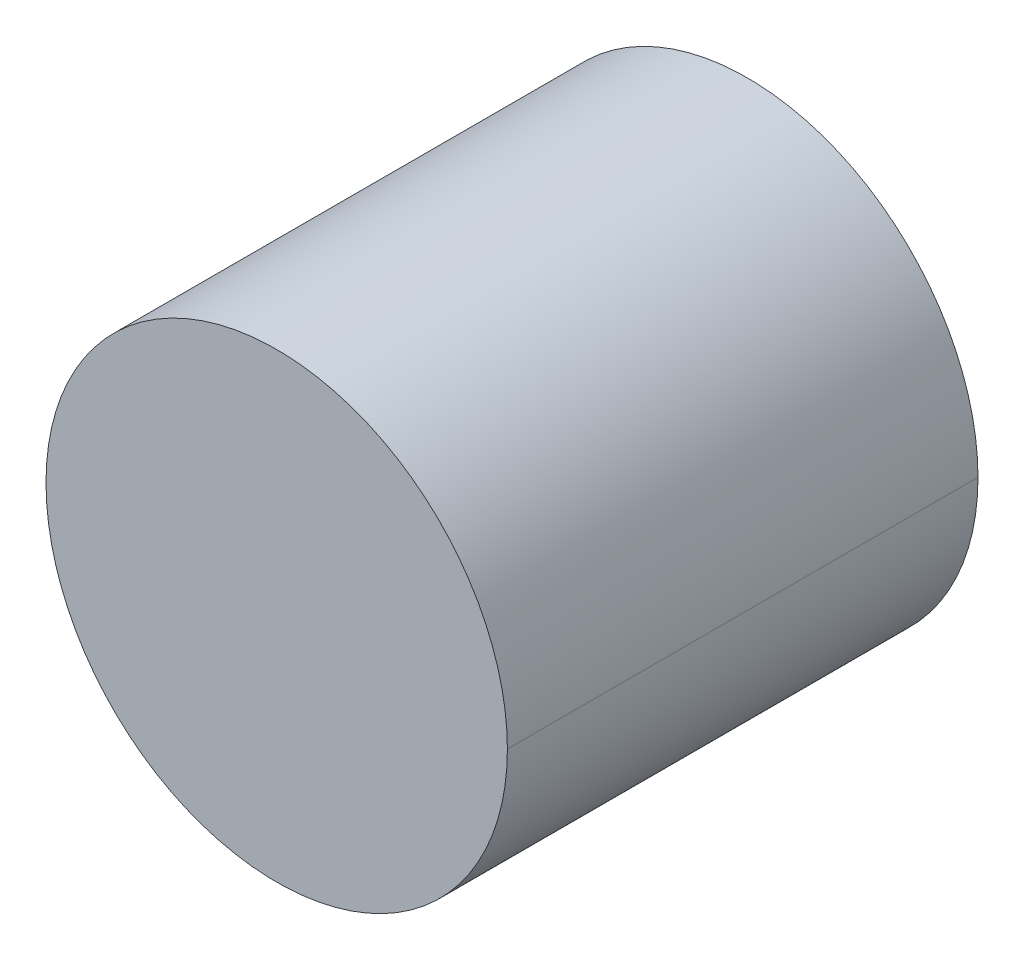
ISO-10303-21;
HEADER;
FILE_DESCRIPTION(('STEP AP214'),'2;1');
FILE_NAME('part.step','',(''),(''),'','','');
FILE_SCHEMA(('AUTOMOTIVE_DESIGN { 1 0 10303 214 1 1 1 1 }'));
ENDSEC;
DATA;
#1=APPLICATION_CONTEXT('core data for automotive mechanical design processes');
#2=APPLICATION_PROTOCOL_DEFINITION('international standard','automotive_design',2000,#1);
#3=PRODUCT_CONTEXT('',#1,'mechanical');
#4=PRODUCT('Part','Part','',(#3));
#5=PRODUCT_RELATED_PRODUCT_CATEGORY('part','',(#4));
#6=PRODUCT_DEFINITION_FORMATION('','',#4);
#7=PRODUCT_DEFINITION_CONTEXT('part definition',#1,'design');
#8=PRODUCT_DEFINITION('design','',#6,#7);
#9=PRODUCT_DEFINITION_SHAPE('','',#8);
#10=(LENGTH_UNIT() NAMED_UNIT(*) SI_UNIT(.MILLI.,.METRE.));
#11=(NAMED_UNIT(*) PLANE_ANGLE_UNIT() SI_UNIT($,.RADIAN.));
#12=(NAMED_UNIT(*) SI_UNIT($,.STERADIAN.) SOLID_ANGLE_UNIT());
#13=UNCERTAINTY_MEASURE_WITH_UNIT(LENGTH_MEASURE(1.E-05),#10,'distance_accuracy_value','');
#14=(GEOMETRIC_REPRESENTATION_CONTEXT(3) GLOBAL_UNCERTAINTY_ASSIGNED_CONTEXT((#13)) GLOBAL_UNIT_ASSIGNED_CONTEXT((#10,
#11,#12)) REPRESENTATION_CONTEXT('',''));
#15=CARTESIAN_POINT('',(0.,0.,0.));
#16=DIRECTION('',(0.,0.,1.));
#17=DIRECTION('',(1.,0.,0.));
#18=AXIS2_PLACEMENT_3D('',#15,#16,#17);
#19=CARTESIAN_POINT('',(0.,0.,0.));
#20=DIRECTION('',(0.,0.,-1.));
#21=DIRECTION('',(-1.,0.,0.));
#22=AXIS2_PLACEMENT_3D('',#19,#20,#21);
#23=CYLINDRICAL_SURFACE('',#22,2.5);
#24=DIRECTION('',(0.,0.,-1.));
#25=VECTOR('',#24,1.);
#26=CARTESIAN_POINT('',(2.5,0.,0.));
#27=LINE('',#26,#25);
#28=CARTESIAN_POINT('',(2.5,0.,5.1));
#29=VERTEX_POINT('',#28);
#30=CARTESIAN_POINT('',(2.5,0.,0.));
#31=VERTEX_POINT('',#30);
#32=EDGE_CURVE('E52',#29,#31,#27,.T.);
#33=ORIENTED_EDGE('',*,*,#32,.F.);
#34=CARTESIAN_POINT('',(0.,0.,5.1));
#35=DIRECTION('',(0.,0.,-1.));
#36=DIRECTION('',(-1.,0.,0.));
#37=AXIS2_PLACEMENT_3D('',#34,#35,#36);
#38=CIRCLE('',#37,2.5);
#39=CARTESIAN_POINT('',(-2.5,0.,5.1));
#40=VERTEX_POINT('',#39);
#41=EDGE_CURVE('E11',#29,#40,#38,.T.);
#42=ORIENTED_EDGE('',*,*,#41,.T.);
#43=DIRECTION('',(0.,0.,-1.));
#44=VECTOR('',#43,1.);
#45=CARTESIAN_POINT('',(-2.5,0.,0.));
#46=LINE('',#45,#44);
#47=CARTESIAN_POINT('',(-2.5,0.,0.));
#48=VERTEX_POINT('',#47);
#49=EDGE_CURVE('E49',#40,#48,#46,.T.);
#50=ORIENTED_EDGE('',*,*,#49,.T.);
#51=CARTESIAN_POINT('',(0.,0.,0.));
#52=DIRECTION('',(0.,0.,1.));
#53=DIRECTION('',(-1.,0.,0.));
#54=AXIS2_PLACEMENT_3D('',#51,#52,#53);
#55=CIRCLE('',#54,2.5);
#56=EDGE_CURVE('E19',#48,#31,#55,.T.);
#57=ORIENTED_EDGE('',*,*,#56,.T.);
#58=EDGE_LOOP('',(#33,#42,#50,#57));
#59=FACE_BOUND('',#58,.T.);
#60=ADVANCED_FACE('F16',(#59),#23,.T.);
#61=CARTESIAN_POINT('',(2.5,0.,5.1));
#62=DIRECTION('',(0.,0.,-1.));
#63=DIRECTION('',(0.,-1.,0.));
#64=AXIS2_PLACEMENT_3D('',#61,#62,#63);
#65=PLANE('',#64);
#66=CARTESIAN_POINT('',(0.,0.,5.1));
#67=DIRECTION('',(0.,0.,-1.));
#68=DIRECTION('',(-1.,0.,0.));
#69=AXIS2_PLACEMENT_3D('',#66,#67,#68);
#70=CIRCLE('',#69,2.5);
#71=EDGE_CURVE('E58',#40,#29,#70,.T.);
#72=ORIENTED_EDGE('',*,*,#71,.F.);
#73=ORIENTED_EDGE('',*,*,#41,.F.);
#74=EDGE_LOOP('',(#72,#73));
#75=FACE_BOUND('',#74,.T.);
#76=ADVANCED_FACE('F61',(#75),#65,.F.);
#77=CARTESIAN_POINT('',(2.5,0.,0.));
#78=DIRECTION('',(0.,0.,-1.));
#79=DIRECTION('',(0.,-1.,0.));
#80=AXIS2_PLACEMENT_3D('',#77,#78,#79);
#81=PLANE('',#80);
#82=ORIENTED_EDGE('',*,*,#56,.F.);
#83=CARTESIAN_POINT('',(0.,0.,0.));
#84=DIRECTION('',(0.,0.,1.));
#85=DIRECTION('',(-1.,0.,0.));
#86=AXIS2_PLACEMENT_3D('',#83,#84,#85);
#87=CIRCLE('',#86,2.5);
#88=EDGE_CURVE('E59',#31,#48,#87,.T.);
#89=ORIENTED_EDGE('',*,*,#88,.F.);
#90=EDGE_LOOP('',(#82,#89));
#91=FACE_BOUND('',#90,.T.);
#92=ADVANCED_FACE('F97',(#91),#81,.T.);
#93=CARTESIAN_POINT('',(0.,0.,0.));
#94=DIRECTION('',(0.,0.,-1.));
#95=DIRECTION('',(-1.,0.,0.));
#96=AXIS2_PLACEMENT_3D('',#93,#94,#95);
#97=CYLINDRICAL_SURFACE('',#96,2.5);
#98=ORIENTED_EDGE('',*,*,#71,.T.);
#99=ORIENTED_EDGE('',*,*,#32,.T.);
#100=ORIENTED_EDGE('',*,*,#88,.T.);
#101=ORIENTED_EDGE('',*,*,#49,.F.);
#102=EDGE_LOOP('',(#98,#99,#100,#101));
#103=FACE_BOUND('',#102,.T.);
#104=ADVANCED_FACE('F57',(#103),#97,.T.);
#105=CLOSED_SHELL('',(#60,#76,#92,#104));
#106=MANIFOLD_SOLID_BREP('B1',#105);
#107=ADVANCED_BREP_SHAPE_REPRESENTATION('',(#18,#106),#14);
#108=SHAPE_DEFINITION_REPRESENTATION(#9,#107);
ENDSEC;
END-ISO-10303-21;
